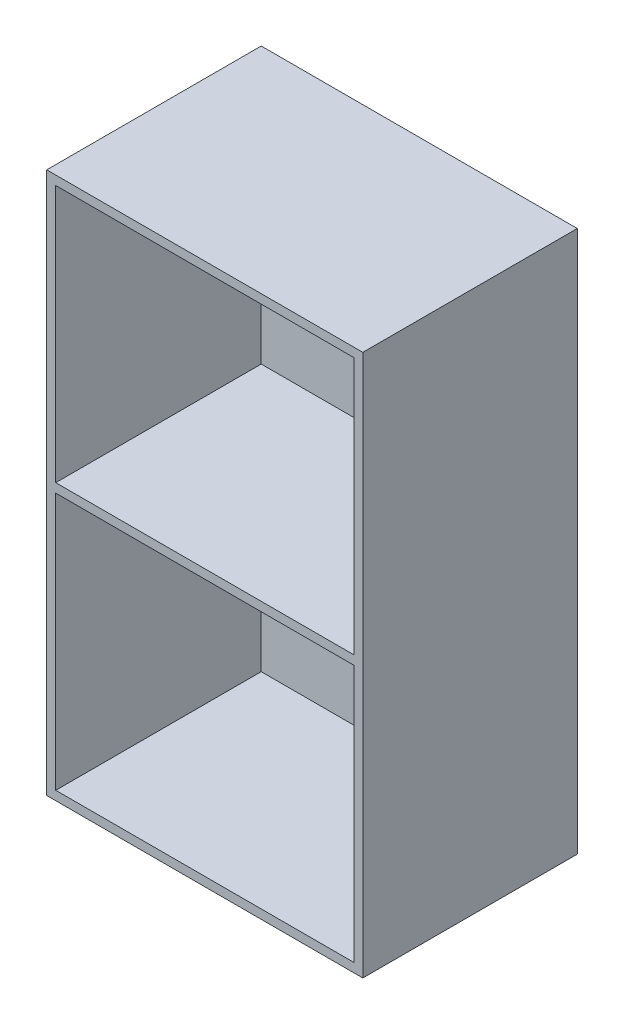
ISO-10303-21;
HEADER;
FILE_DESCRIPTION(('STEP AP214'),'2;1');
FILE_NAME('part.step','',(''),(''),'','','');
FILE_SCHEMA(('AUTOMOTIVE_DESIGN { 1 0 10303 214 1 1 1 1 }'));
ENDSEC;
DATA;
#1=APPLICATION_CONTEXT('core data for automotive mechanical design processes');
#2=APPLICATION_PROTOCOL_DEFINITION('international standard','automotive_design',2000,#1);
#3=PRODUCT_CONTEXT('',#1,'mechanical');
#4=PRODUCT('Part','Part','',(#3));
#5=PRODUCT_RELATED_PRODUCT_CATEGORY('part','',(#4));
#6=PRODUCT_DEFINITION_FORMATION('','',#4);
#7=PRODUCT_DEFINITION_CONTEXT('part definition',#1,'design');
#8=PRODUCT_DEFINITION('design','',#6,#7);
#9=PRODUCT_DEFINITION_SHAPE('','',#8);
#10=(LENGTH_UNIT() NAMED_UNIT(*) SI_UNIT(.MILLI.,.METRE.));
#11=(NAMED_UNIT(*) PLANE_ANGLE_UNIT() SI_UNIT($,.RADIAN.));
#12=(NAMED_UNIT(*) SI_UNIT($,.STERADIAN.) SOLID_ANGLE_UNIT());
#13=UNCERTAINTY_MEASURE_WITH_UNIT(LENGTH_MEASURE(1.E-05),#10,'distance_accuracy_value','');
#14=(GEOMETRIC_REPRESENTATION_CONTEXT(3) GLOBAL_UNCERTAINTY_ASSIGNED_CONTEXT((#13)) GLOBAL_UNIT_ASSIGNED_CONTEXT((#10,
#11,#12)) REPRESENTATION_CONTEXT('',''));
#15=CARTESIAN_POINT('',(0.,0.,0.));
#16=DIRECTION('',(0.,0.,1.));
#17=DIRECTION('',(1.,0.,0.));
#18=AXIS2_PLACEMENT_3D('',#15,#16,#17);
#19=CARTESIAN_POINT('',(210.,360.,12.));
#20=DIRECTION('',(-1.,0.,0.));
#21=DIRECTION('',(0.,-1.,0.));
#22=AXIS2_PLACEMENT_3D('',#19,#20,#21);
#23=PLANE('',#22);
#24=DIRECTION('',(0.,1.,0.));
#25=VECTOR('',#24,1.);
#26=CARTESIAN_POINT('',(210.,360.,0.));
#27=LINE('',#26,#25);
#28=CARTESIAN_POINT('',(210.,-360.,0.));
#29=VERTEX_POINT('',#28);
#30=CARTESIAN_POINT('',(210.,360.,0.));
#31=VERTEX_POINT('',#30);
#32=EDGE_CURVE('E199',#29,#31,#27,.T.);
#33=ORIENTED_EDGE('',*,*,#32,.T.);
#34=DIRECTION('',(0.,0.,-1.));
#35=VECTOR('',#34,1.);
#36=CARTESIAN_POINT('',(210.,360.,12.));
#37=LINE('',#36,#35);
#38=CARTESIAN_POINT('',(210.,360.,285.));
#39=VERTEX_POINT('',#38);
#40=EDGE_CURVE('E11',#39,#31,#37,.T.);
#41=ORIENTED_EDGE('',*,*,#40,.F.);
#42=DIRECTION('',(0.,1.,0.));
#43=VECTOR('',#42,1.);
#44=CARTESIAN_POINT('',(210.,360.,285.));
#45=LINE('',#44,#43);
#46=CARTESIAN_POINT('',(210.,-360.,285.));
#47=VERTEX_POINT('',#46);
#48=EDGE_CURVE('E187',#47,#39,#45,.T.);
#49=ORIENTED_EDGE('',*,*,#48,.F.);
#50=DIRECTION('',(0.,0.,-1.));
#51=VECTOR('',#50,1.);
#52=CARTESIAN_POINT('',(210.,-360.,12.));
#53=LINE('',#52,#51);
#54=EDGE_CURVE('E208',#47,#29,#53,.T.);
#55=ORIENTED_EDGE('',*,*,#54,.T.);
#56=EDGE_LOOP('',(#33,#41,#49,#55));
#57=FACE_BOUND('',#56,.T.);
#58=ADVANCED_FACE('F33',(#57),#23,.F.);
#59=CARTESIAN_POINT('',(-210.,360.,12.));
#60=DIRECTION('',(0.,-1.,0.));
#61=DIRECTION('',(0.,0.,-1.));
#62=AXIS2_PLACEMENT_3D('',#59,#60,#61);
#63=PLANE('',#62);
#64=DIRECTION('',(-1.,0.,0.));
#65=VECTOR('',#64,1.);
#66=CARTESIAN_POINT('',(-210.,360.,0.));
#67=LINE('',#66,#65);
#68=CARTESIAN_POINT('',(-210.,360.,0.));
#69=VERTEX_POINT('',#68);
#70=EDGE_CURVE('E202',#31,#69,#67,.T.);
#71=ORIENTED_EDGE('',*,*,#70,.T.);
#72=DIRECTION('',(0.,0.,-1.));
#73=VECTOR('',#72,1.);
#74=CARTESIAN_POINT('',(-210.,360.,12.));
#75=LINE('',#74,#73);
#76=CARTESIAN_POINT('',(-210.,360.,285.));
#77=VERTEX_POINT('',#76);
#78=EDGE_CURVE('E40',#77,#69,#75,.T.);
#79=ORIENTED_EDGE('',*,*,#78,.F.);
#80=DIRECTION('',(-1.,0.,0.));
#81=VECTOR('',#80,1.);
#82=CARTESIAN_POINT('',(-210.,360.,285.));
#83=LINE('',#82,#81);
#84=EDGE_CURVE('E190',#39,#77,#83,.T.);
#85=ORIENTED_EDGE('',*,*,#84,.F.);
#86=ORIENTED_EDGE('',*,*,#40,.T.);
#87=EDGE_LOOP('',(#71,#79,#85,#86));
#88=FACE_BOUND('',#87,.T.);
#89=ADVANCED_FACE('F231',(#88),#63,.F.);
#90=CARTESIAN_POINT('',(-210.,360.,12.));
#91=DIRECTION('',(1.,0.,0.));
#92=DIRECTION('',(0.,1.,0.));
#93=AXIS2_PLACEMENT_3D('',#90,#91,#92);
#94=PLANE('',#93);
#95=DIRECTION('',(0.,-1.,0.));
#96=VECTOR('',#95,1.);
#97=CARTESIAN_POINT('',(-210.,360.,0.));
#98=LINE('',#97,#96);
#99=CARTESIAN_POINT('',(-210.,-360.,0.));
#100=VERTEX_POINT('',#99);
#101=EDGE_CURVE('E204',#69,#100,#98,.T.);
#102=ORIENTED_EDGE('',*,*,#101,.T.);
#103=DIRECTION('',(0.,0.,-1.));
#104=VECTOR('',#103,1.);
#105=CARTESIAN_POINT('',(-210.,-360.,12.));
#106=LINE('',#105,#104);
#107=CARTESIAN_POINT('',(-210.,-360.,285.));
#108=VERTEX_POINT('',#107);
#109=EDGE_CURVE('E211',#108,#100,#106,.T.);
#110=ORIENTED_EDGE('',*,*,#109,.F.);
#111=DIRECTION('',(0.,-1.,0.));
#112=VECTOR('',#111,1.);
#113=CARTESIAN_POINT('',(-210.,360.,285.));
#114=LINE('',#113,#112);
#115=EDGE_CURVE('E193',#77,#108,#114,.T.);
#116=ORIENTED_EDGE('',*,*,#115,.F.);
#117=ORIENTED_EDGE('',*,*,#78,.T.);
#118=EDGE_LOOP('',(#102,#110,#116,#117));
#119=FACE_BOUND('',#118,.T.);
#120=ADVANCED_FACE('F217',(#119),#94,.F.);
#121=CARTESIAN_POINT('',(-210.,-360.,12.));
#122=DIRECTION('',(0.,1.,0.));
#123=DIRECTION('',(0.,0.,1.));
#124=AXIS2_PLACEMENT_3D('',#121,#122,#123);
#125=PLANE('',#124);
#126=DIRECTION('',(1.,0.,0.));
#127=VECTOR('',#126,1.);
#128=CARTESIAN_POINT('',(-210.,-360.,0.));
#129=LINE('',#128,#127);
#130=EDGE_CURVE('E206',#100,#29,#129,.T.);
#131=ORIENTED_EDGE('',*,*,#130,.T.);
#132=ORIENTED_EDGE('',*,*,#54,.F.);
#133=DIRECTION('',(1.,0.,0.));
#134=VECTOR('',#133,1.);
#135=CARTESIAN_POINT('',(-210.,-360.,285.));
#136=LINE('',#135,#134);
#137=EDGE_CURVE('E196',#108,#47,#136,.T.);
#138=ORIENTED_EDGE('',*,*,#137,.F.);
#139=ORIENTED_EDGE('',*,*,#109,.T.);
#140=EDGE_LOOP('',(#131,#132,#138,#139));
#141=FACE_BOUND('',#140,.T.);
#142=ADVANCED_FACE('F225',(#141),#125,.F.);
#143=CARTESIAN_POINT('',(0.,0.,0.));
#144=DIRECTION('',(0.,0.,1.));
#145=DIRECTION('',(1.,0.,0.));
#146=AXIS2_PLACEMENT_3D('',#143,#144,#145);
#147=PLANE('',#146);
#148=ORIENTED_EDGE('',*,*,#32,.F.);
#149=ORIENTED_EDGE('',*,*,#130,.F.);
#150=ORIENTED_EDGE('',*,*,#101,.F.);
#151=ORIENTED_EDGE('',*,*,#70,.F.);
#152=EDGE_LOOP('',(#148,#149,#150,#151));
#153=FACE_BOUND('',#152,.T.);
#154=ADVANCED_FACE('F223',(#153),#147,.F.);
#155=CARTESIAN_POINT('',(0.,0.,285.));
#156=DIRECTION('',(0.,0.,1.));
#157=DIRECTION('',(1.,0.,0.));
#158=AXIS2_PLACEMENT_3D('',#155,#156,#157);
#159=PLANE('',#158);
#160=ORIENTED_EDGE('',*,*,#48,.T.);
#161=ORIENTED_EDGE('',*,*,#84,.T.);
#162=ORIENTED_EDGE('',*,*,#115,.T.);
#163=ORIENTED_EDGE('',*,*,#137,.T.);
#164=EDGE_LOOP('',(#160,#161,#162,#163));
#165=FACE_BOUND('',#164,.T.);
#166=DIRECTION('',(0.,-1.,0.));
#167=VECTOR('',#166,1.);
#168=CARTESIAN_POINT('',(-198.,348.,285.));
#169=LINE('',#168,#167);
#170=CARTESIAN_POINT('',(-198.,348.,285.));
#171=VERTEX_POINT('',#170);
#172=CARTESIAN_POINT('',(-198.,6.,285.));
#173=VERTEX_POINT('',#172);
#174=EDGE_CURVE('E163',#171,#173,#169,.T.);
#175=ORIENTED_EDGE('',*,*,#174,.F.);
#176=DIRECTION('',(-1.,0.,0.));
#177=VECTOR('',#176,1.);
#178=CARTESIAN_POINT('',(-198.,348.,285.));
#179=LINE('',#178,#177);
#180=CARTESIAN_POINT('',(198.,348.,285.));
#181=VERTEX_POINT('',#180);
#182=EDGE_CURVE('E161',#181,#171,#179,.T.);
#183=ORIENTED_EDGE('',*,*,#182,.F.);
#184=DIRECTION('',(0.,1.,0.));
#185=VECTOR('',#184,1.);
#186=CARTESIAN_POINT('',(198.,348.,285.));
#187=LINE('',#186,#185);
#188=CARTESIAN_POINT('',(198.,6.,285.));
#189=VERTEX_POINT('',#188);
#190=EDGE_CURVE('E169',#189,#181,#187,.T.);
#191=ORIENTED_EDGE('',*,*,#190,.F.);
#192=DIRECTION('',(1.,0.,0.));
#193=VECTOR('',#192,1.);
#194=CARTESIAN_POINT('',(-198.,6.,285.));
#195=LINE('',#194,#193);
#196=EDGE_CURVE('E166',#173,#189,#195,.T.);
#197=ORIENTED_EDGE('',*,*,#196,.F.);
#198=EDGE_LOOP('',(#175,#183,#191,#197));
#199=FACE_BOUND('',#198,.T.);
#200=DIRECTION('',(1.,0.,0.));
#201=VECTOR('',#200,1.);
#202=CARTESIAN_POINT('',(-198.,-348.,285.));
#203=LINE('',#202,#201);
#204=CARTESIAN_POINT('',(-198.,-348.,285.));
#205=VERTEX_POINT('',#204);
#206=CARTESIAN_POINT('',(198.,-348.,285.));
#207=VERTEX_POINT('',#206);
#208=EDGE_CURVE('E130',#205,#207,#203,.T.);
#209=ORIENTED_EDGE('',*,*,#208,.F.);
#210=DIRECTION('',(0.,-1.,0.));
#211=VECTOR('',#210,1.);
#212=CARTESIAN_POINT('',(-198.,-6.,285.));
#213=LINE('',#212,#211);
#214=CARTESIAN_POINT('',(-198.,-6.,285.));
#215=VERTEX_POINT('',#214);
#216=EDGE_CURVE('E120',#215,#205,#213,.T.);
#217=ORIENTED_EDGE('',*,*,#216,.F.);
#218=DIRECTION('',(-1.,0.,0.));
#219=VECTOR('',#218,1.);
#220=CARTESIAN_POINT('',(-198.,-6.,285.));
#221=LINE('',#220,#219);
#222=CARTESIAN_POINT('',(198.,-6.,285.));
#223=VERTEX_POINT('',#222);
#224=EDGE_CURVE('E146',#223,#215,#221,.T.);
#225=ORIENTED_EDGE('',*,*,#224,.F.);
#226=DIRECTION('',(0.,1.,0.));
#227=VECTOR('',#226,1.);
#228=CARTESIAN_POINT('',(198.,-6.,285.));
#229=LINE('',#228,#227);
#230=EDGE_CURVE('E144',#207,#223,#229,.T.);
#231=ORIENTED_EDGE('',*,*,#230,.F.);
#232=EDGE_LOOP('',(#209,#217,#225,#231));
#233=FACE_BOUND('',#232,.T.);
#234=ADVANCED_FACE('F142',(#165,#199,#233),#159,.T.);
#235=CARTESIAN_POINT('',(-198.,348.,285.));
#236=DIRECTION('',(0.,-1.,0.));
#237=DIRECTION('',(0.,0.,-1.));
#238=AXIS2_PLACEMENT_3D('',#235,#236,#237);
#239=PLANE('',#238);
#240=DIRECTION('',(-1.,0.,0.));
#241=VECTOR('',#240,1.);
#242=CARTESIAN_POINT('',(-198.,348.,12.));
#243=LINE('',#242,#241);
#244=CARTESIAN_POINT('',(198.,348.,12.));
#245=VERTEX_POINT('',#244);
#246=CARTESIAN_POINT('',(-198.,348.,12.));
#247=VERTEX_POINT('',#246);
#248=EDGE_CURVE('E47',#245,#247,#243,.T.);
#249=ORIENTED_EDGE('',*,*,#248,.F.);
#250=DIRECTION('',(0.,0.,-1.));
#251=VECTOR('',#250,1.);
#252=CARTESIAN_POINT('',(198.,348.,285.));
#253=LINE('',#252,#251);
#254=EDGE_CURVE('E171',#181,#245,#253,.T.);
#255=ORIENTED_EDGE('',*,*,#254,.F.);
#256=ORIENTED_EDGE('',*,*,#182,.T.);
#257=DIRECTION('',(0.,0.,-1.));
#258=VECTOR('',#257,1.);
#259=CARTESIAN_POINT('',(-198.,348.,285.));
#260=LINE('',#259,#258);
#261=EDGE_CURVE('E184',#171,#247,#260,.T.);
#262=ORIENTED_EDGE('',*,*,#261,.T.);
#263=EDGE_LOOP('',(#249,#255,#256,#262));
#264=FACE_BOUND('',#263,.T.);
#265=ADVANCED_FACE('F251',(#264),#239,.T.);
#266=CARTESIAN_POINT('',(-198.,348.,285.));
#267=DIRECTION('',(1.,0.,0.));
#268=DIRECTION('',(0.,0.,-1.));
#269=AXIS2_PLACEMENT_3D('',#266,#267,#268);
#270=PLANE('',#269);
#271=DIRECTION('',(0.,-1.,0.));
#272=VECTOR('',#271,1.);
#273=CARTESIAN_POINT('',(-198.,348.,12.));
#274=LINE('',#273,#272);
#275=CARTESIAN_POINT('',(-198.,6.,12.));
#276=VERTEX_POINT('',#275);
#277=EDGE_CURVE('E51',#247,#276,#274,.T.);
#278=ORIENTED_EDGE('',*,*,#277,.F.);
#279=ORIENTED_EDGE('',*,*,#261,.F.);
#280=ORIENTED_EDGE('',*,*,#174,.T.);
#281=DIRECTION('',(0.,0.,-1.));
#282=VECTOR('',#281,1.);
#283=CARTESIAN_POINT('',(-198.,6.,285.));
#284=LINE('',#283,#282);
#285=EDGE_CURVE('E182',#173,#276,#284,.T.);
#286=ORIENTED_EDGE('',*,*,#285,.T.);
#287=EDGE_LOOP('',(#278,#279,#280,#286));
#288=FACE_BOUND('',#287,.T.);
#289=ADVANCED_FACE('F254',(#288),#270,.T.);
#290=CARTESIAN_POINT('',(-198.,6.,285.));
#291=DIRECTION('',(0.,1.,0.));
#292=DIRECTION('',(0.,0.,1.));
#293=AXIS2_PLACEMENT_3D('',#290,#291,#292);
#294=PLANE('',#293);
#295=DIRECTION('',(1.,0.,0.));
#296=VECTOR('',#295,1.);
#297=CARTESIAN_POINT('',(-198.,6.,12.));
#298=LINE('',#297,#296);
#299=CARTESIAN_POINT('',(198.,6.,12.));
#300=VERTEX_POINT('',#299);
#301=EDGE_CURVE('E174',#276,#300,#298,.T.);
#302=ORIENTED_EDGE('',*,*,#301,.F.);
#303=ORIENTED_EDGE('',*,*,#285,.F.);
#304=ORIENTED_EDGE('',*,*,#196,.T.);
#305=DIRECTION('',(0.,0.,-1.));
#306=VECTOR('',#305,1.);
#307=CARTESIAN_POINT('',(198.,6.,285.));
#308=LINE('',#307,#306);
#309=EDGE_CURVE('E179',#189,#300,#308,.T.);
#310=ORIENTED_EDGE('',*,*,#309,.T.);
#311=EDGE_LOOP('',(#302,#303,#304,#310));
#312=FACE_BOUND('',#311,.T.);
#313=ADVANCED_FACE('F258',(#312),#294,.T.);
#314=CARTESIAN_POINT('',(198.,348.,285.));
#315=DIRECTION('',(-1.,0.,0.));
#316=DIRECTION('',(0.,0.,1.));
#317=AXIS2_PLACEMENT_3D('',#314,#315,#316);
#318=PLANE('',#317);
#319=DIRECTION('',(0.,1.,0.));
#320=VECTOR('',#319,1.);
#321=CARTESIAN_POINT('',(198.,348.,12.));
#322=LINE('',#321,#320);
#323=EDGE_CURVE('E164',#300,#245,#322,.T.);
#324=ORIENTED_EDGE('',*,*,#323,.F.);
#325=ORIENTED_EDGE('',*,*,#309,.F.);
#326=ORIENTED_EDGE('',*,*,#190,.T.);
#327=ORIENTED_EDGE('',*,*,#254,.T.);
#328=EDGE_LOOP('',(#324,#325,#326,#327));
#329=FACE_BOUND('',#328,.T.);
#330=ADVANCED_FACE('F262',(#329),#318,.T.);
#331=CARTESIAN_POINT('',(-198.,-6.,285.));
#332=DIRECTION('',(1.,0.,0.));
#333=DIRECTION('',(0.,0.,-1.));
#334=AXIS2_PLACEMENT_3D('',#331,#332,#333);
#335=PLANE('',#334);
#336=DIRECTION('',(0.,-1.,0.));
#337=VECTOR('',#336,1.);
#338=CARTESIAN_POINT('',(-198.,-6.,12.));
#339=LINE('',#338,#337);
#340=CARTESIAN_POINT('',(-198.,-6.,12.));
#341=VERTEX_POINT('',#340);
#342=CARTESIAN_POINT('',(-198.,-348.,12.));
#343=VERTEX_POINT('',#342);
#344=EDGE_CURVE('E150',#341,#343,#339,.T.);
#345=ORIENTED_EDGE('',*,*,#344,.F.);
#346=DIRECTION('',(0.,0.,-1.));
#347=VECTOR('',#346,1.);
#348=CARTESIAN_POINT('',(-198.,-6.,285.));
#349=LINE('',#348,#347);
#350=EDGE_CURVE('E126',#215,#341,#349,.T.);
#351=ORIENTED_EDGE('',*,*,#350,.F.);
#352=ORIENTED_EDGE('',*,*,#216,.T.);
#353=DIRECTION('',(0.,0.,-1.));
#354=VECTOR('',#353,1.);
#355=CARTESIAN_POINT('',(-198.,-348.,285.));
#356=LINE('',#355,#354);
#357=EDGE_CURVE('E124',#205,#343,#356,.T.);
#358=ORIENTED_EDGE('',*,*,#357,.T.);
#359=EDGE_LOOP('',(#345,#351,#352,#358));
#360=FACE_BOUND('',#359,.T.);
#361=ADVANCED_FACE('F123',(#360),#335,.T.);
#362=CARTESIAN_POINT('',(-198.,-348.,285.));
#363=DIRECTION('',(0.,1.,0.));
#364=DIRECTION('',(0.,0.,1.));
#365=AXIS2_PLACEMENT_3D('',#362,#363,#364);
#366=PLANE('',#365);
#367=DIRECTION('',(1.,0.,0.));
#368=VECTOR('',#367,1.);
#369=CARTESIAN_POINT('',(-198.,-348.,12.));
#370=LINE('',#369,#368);
#371=CARTESIAN_POINT('',(198.,-348.,12.));
#372=VERTEX_POINT('',#371);
#373=EDGE_CURVE('E138',#343,#372,#370,.T.);
#374=ORIENTED_EDGE('',*,*,#373,.F.);
#375=ORIENTED_EDGE('',*,*,#357,.F.);
#376=ORIENTED_EDGE('',*,*,#208,.T.);
#377=DIRECTION('',(0.,0.,-1.));
#378=VECTOR('',#377,1.);
#379=CARTESIAN_POINT('',(198.,-348.,285.));
#380=LINE('',#379,#378);
#381=EDGE_CURVE('E139',#207,#372,#380,.T.);
#382=ORIENTED_EDGE('',*,*,#381,.T.);
#383=EDGE_LOOP('',(#374,#375,#376,#382));
#384=FACE_BOUND('',#383,.T.);
#385=ADVANCED_FACE('F135',(#384),#366,.T.);
#386=CARTESIAN_POINT('',(198.,-6.,285.));
#387=DIRECTION('',(-1.,0.,0.));
#388=DIRECTION('',(0.,0.,1.));
#389=AXIS2_PLACEMENT_3D('',#386,#387,#388);
#390=PLANE('',#389);
#391=DIRECTION('',(0.,1.,0.));
#392=VECTOR('',#391,1.);
#393=CARTESIAN_POINT('',(198.,-6.,12.));
#394=LINE('',#393,#392);
#395=CARTESIAN_POINT('',(198.,-6.,12.));
#396=VERTEX_POINT('',#395);
#397=EDGE_CURVE('E153',#372,#396,#394,.T.);
#398=ORIENTED_EDGE('',*,*,#397,.F.);
#399=ORIENTED_EDGE('',*,*,#381,.F.);
#400=ORIENTED_EDGE('',*,*,#230,.T.);
#401=DIRECTION('',(0.,0.,-1.));
#402=VECTOR('',#401,1.);
#403=CARTESIAN_POINT('',(198.,-6.,285.));
#404=LINE('',#403,#402);
#405=EDGE_CURVE('E157',#223,#396,#404,.T.);
#406=ORIENTED_EDGE('',*,*,#405,.T.);
#407=EDGE_LOOP('',(#398,#399,#400,#406));
#408=FACE_BOUND('',#407,.T.);
#409=ADVANCED_FACE('F271',(#408),#390,.T.);
#410=CARTESIAN_POINT('',(-198.,-6.,285.));
#411=DIRECTION('',(0.,-1.,0.));
#412=DIRECTION('',(0.,0.,-1.));
#413=AXIS2_PLACEMENT_3D('',#410,#411,#412);
#414=PLANE('',#413);
#415=DIRECTION('',(-1.,0.,0.));
#416=VECTOR('',#415,1.);
#417=CARTESIAN_POINT('',(-198.,-6.,12.));
#418=LINE('',#417,#416);
#419=EDGE_CURVE('E131',#396,#341,#418,.T.);
#420=ORIENTED_EDGE('',*,*,#419,.F.);
#421=ORIENTED_EDGE('',*,*,#405,.F.);
#422=ORIENTED_EDGE('',*,*,#224,.T.);
#423=ORIENTED_EDGE('',*,*,#350,.T.);
#424=EDGE_LOOP('',(#420,#421,#422,#423));
#425=FACE_BOUND('',#424,.T.);
#426=ADVANCED_FACE('F247',(#425),#414,.T.);
#427=CARTESIAN_POINT('',(0.,0.,12.));
#428=DIRECTION('',(0.,0.,1.));
#429=DIRECTION('',(1.,0.,0.));
#430=AXIS2_PLACEMENT_3D('',#427,#428,#429);
#431=PLANE('',#430);
#432=ORIENTED_EDGE('',*,*,#344,.T.);
#433=ORIENTED_EDGE('',*,*,#373,.T.);
#434=ORIENTED_EDGE('',*,*,#397,.T.);
#435=ORIENTED_EDGE('',*,*,#419,.T.);
#436=EDGE_LOOP('',(#432,#433,#434,#435));
#437=FACE_BOUND('',#436,.T.);
#438=ADVANCED_FACE('F243',(#437),#431,.T.);
#439=ORIENTED_EDGE('',*,*,#248,.T.);
#440=ORIENTED_EDGE('',*,*,#277,.T.);
#441=ORIENTED_EDGE('',*,*,#301,.T.);
#442=ORIENTED_EDGE('',*,*,#323,.T.);
#443=EDGE_LOOP('',(#439,#440,#441,#442));
#444=FACE_BOUND('',#443,.T.);
#445=ADVANCED_FACE('F246',(#444),#431,.T.);
#446=CLOSED_SHELL('',(#58,#89,#120,#142,#154,#234,#265,#289,#313,#330,#361,#385,#409,#426,#438,#445));
#447=MANIFOLD_SOLID_BREP('B2',#446);
#448=ADVANCED_BREP_SHAPE_REPRESENTATION('',(#18,#447),#14);
#449=SHAPE_DEFINITION_REPRESENTATION(#9,#448);
ENDSEC;
END-ISO-10303-21;
